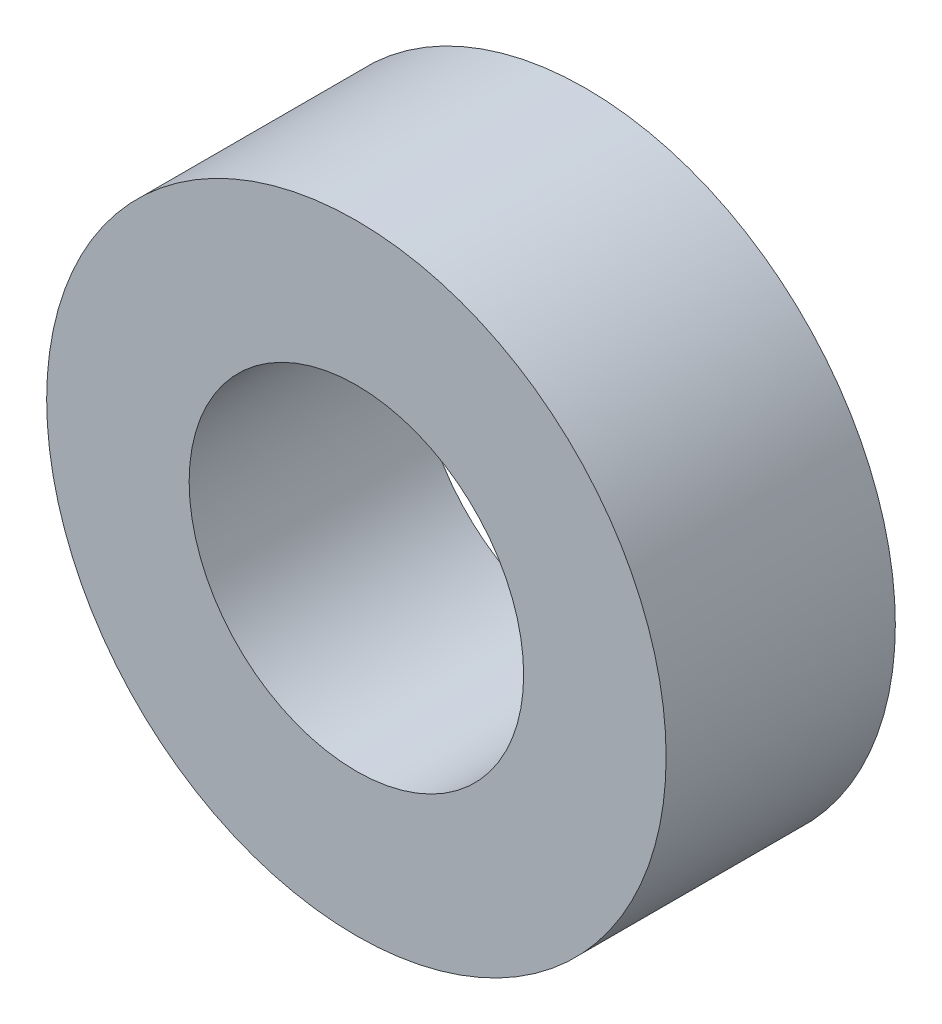
ISO-10303-21;
HEADER;
FILE_DESCRIPTION(('STEP AP214'),'2;1');
FILE_NAME('part.step','',(''),(''),'','','');
FILE_SCHEMA(('AUTOMOTIVE_DESIGN { 1 0 10303 214 1 1 1 1 }'));
ENDSEC;
DATA;
#1=APPLICATION_CONTEXT('core data for automotive mechanical design processes');
#2=APPLICATION_PROTOCOL_DEFINITION('international standard','automotive_design',2000,#1);
#3=PRODUCT_CONTEXT('',#1,'mechanical');
#4=PRODUCT('Part','Part','',(#3));
#5=PRODUCT_RELATED_PRODUCT_CATEGORY('part','',(#4));
#6=PRODUCT_DEFINITION_FORMATION('','',#4);
#7=PRODUCT_DEFINITION_CONTEXT('part definition',#1,'design');
#8=PRODUCT_DEFINITION('design','',#6,#7);
#9=PRODUCT_DEFINITION_SHAPE('','',#8);
#10=(LENGTH_UNIT() NAMED_UNIT(*) SI_UNIT(.MILLI.,.METRE.));
#11=(NAMED_UNIT(*) PLANE_ANGLE_UNIT() SI_UNIT($,.RADIAN.));
#12=(NAMED_UNIT(*) SI_UNIT($,.STERADIAN.) SOLID_ANGLE_UNIT());
#13=UNCERTAINTY_MEASURE_WITH_UNIT(LENGTH_MEASURE(1.E-05),#10,'distance_accuracy_value','');
#14=(GEOMETRIC_REPRESENTATION_CONTEXT(3) GLOBAL_UNCERTAINTY_ASSIGNED_CONTEXT((#13)) GLOBAL_UNIT_ASSIGNED_CONTEXT((#10,
#11,#12)) REPRESENTATION_CONTEXT('',''));
#15=CARTESIAN_POINT('',(0.,0.,0.));
#16=DIRECTION('',(0.,0.,1.));
#17=DIRECTION('',(1.,0.,0.));
#18=AXIS2_PLACEMENT_3D('',#15,#16,#17);
#19=CARTESIAN_POINT('',(0.,0.,4.699));
#20=DIRECTION('',(0.,0.,1.));
#21=DIRECTION('',(1.,0.,0.));
#22=AXIS2_PLACEMENT_3D('',#19,#20,#21);
#23=PLANE('',#22);
#24=CARTESIAN_POINT('',(0.,0.,4.699));
#25=DIRECTION('',(0.,0.,1.));
#26=DIRECTION('',(1.,0.,0.));
#27=AXIS2_PLACEMENT_3D('',#24,#25,#26);
#28=CIRCLE('',#27,6.35);
#29=CARTESIAN_POINT('',(6.35,0.,4.699));
#30=VERTEX_POINT('',#29);
#31=EDGE_CURVE('E10',#30,#30,#28,.T.);
#32=ORIENTED_EDGE('',*,*,#31,.T.);
#33=EDGE_LOOP('',(#32));
#34=FACE_BOUND('',#33,.T.);
#35=CARTESIAN_POINT('',(0.,0.,4.699));
#36=DIRECTION('',(0.,0.,1.));
#37=DIRECTION('',(1.,0.,0.));
#38=AXIS2_PLACEMENT_3D('',#35,#36,#37);
#39=CIRCLE('',#38,3.429);
#40=CARTESIAN_POINT('',(3.429,0.,4.699));
#41=VERTEX_POINT('',#40);
#42=EDGE_CURVE('E48',#41,#41,#39,.T.);
#43=ORIENTED_EDGE('',*,*,#42,.F.);
#44=EDGE_LOOP('',(#43));
#45=FACE_BOUND('',#44,.T.);
#46=ADVANCED_FACE('F37',(#34,#45),#23,.T.);
#47=CARTESIAN_POINT('',(0.,0.,0.));
#48=DIRECTION('',(0.,0.,1.));
#49=DIRECTION('',(1.,0.,0.));
#50=AXIS2_PLACEMENT_3D('',#47,#48,#49);
#51=PLANE('',#50);
#52=CARTESIAN_POINT('',(0.,0.,0.));
#53=DIRECTION('',(0.,0.,1.));
#54=DIRECTION('',(1.,0.,0.));
#55=AXIS2_PLACEMENT_3D('',#52,#53,#54);
#56=CIRCLE('',#55,6.35);
#57=CARTESIAN_POINT('',(6.35,0.,0.));
#58=VERTEX_POINT('',#57);
#59=EDGE_CURVE('E41',#58,#58,#56,.T.);
#60=ORIENTED_EDGE('',*,*,#59,.F.);
#61=EDGE_LOOP('',(#60));
#62=FACE_BOUND('',#61,.T.);
#63=CARTESIAN_POINT('',(0.,0.,0.));
#64=DIRECTION('',(0.,0.,1.));
#65=DIRECTION('',(1.,0.,0.));
#66=AXIS2_PLACEMENT_3D('',#63,#64,#65);
#67=CIRCLE('',#66,3.429);
#68=CARTESIAN_POINT('',(3.429,0.,0.));
#69=VERTEX_POINT('',#68);
#70=EDGE_CURVE('E50',#69,#69,#67,.T.);
#71=ORIENTED_EDGE('',*,*,#70,.T.);
#72=EDGE_LOOP('',(#71));
#73=FACE_BOUND('',#72,.T.);
#74=ADVANCED_FACE('F60',(#62,#73),#51,.F.);
#75=CARTESIAN_POINT('',(0.,0.,4.699));
#76=DIRECTION('',(0.,0.,-1.));
#77=DIRECTION('',(-1.,0.,0.));
#78=AXIS2_PLACEMENT_3D('',#75,#76,#77);
#79=CYLINDRICAL_SURFACE('',#78,6.35);
#80=ORIENTED_EDGE('',*,*,#31,.F.);
#81=EDGE_LOOP('',(#80));
#82=FACE_BOUND('',#81,.T.);
#83=ORIENTED_EDGE('',*,*,#59,.T.);
#84=EDGE_LOOP('',(#83));
#85=FACE_BOUND('',#84,.T.);
#86=ADVANCED_FACE('F39',(#82,#85),#79,.T.);
#87=CARTESIAN_POINT('',(0.,0.,4.699));
#88=DIRECTION('',(0.,0.,-1.));
#89=DIRECTION('',(-1.,0.,0.));
#90=AXIS2_PLACEMENT_3D('',#87,#88,#89);
#91=CYLINDRICAL_SURFACE('',#90,3.429);
#92=ORIENTED_EDGE('',*,*,#42,.T.);
#93=EDGE_LOOP('',(#92));
#94=FACE_BOUND('',#93,.T.);
#95=ORIENTED_EDGE('',*,*,#70,.F.);
#96=EDGE_LOOP('',(#95));
#97=FACE_BOUND('',#96,.T.);
#98=ADVANCED_FACE('F56',(#94,#97),#91,.F.);
#99=CLOSED_SHELL('',(#46,#74,#86,#98));
#100=MANIFOLD_SOLID_BREP('B2',#99);
#101=ADVANCED_BREP_SHAPE_REPRESENTATION('',(#18,#100),#14);
#102=SHAPE_DEFINITION_REPRESENTATION(#9,#101);
ENDSEC;
END-ISO-10303-21;
